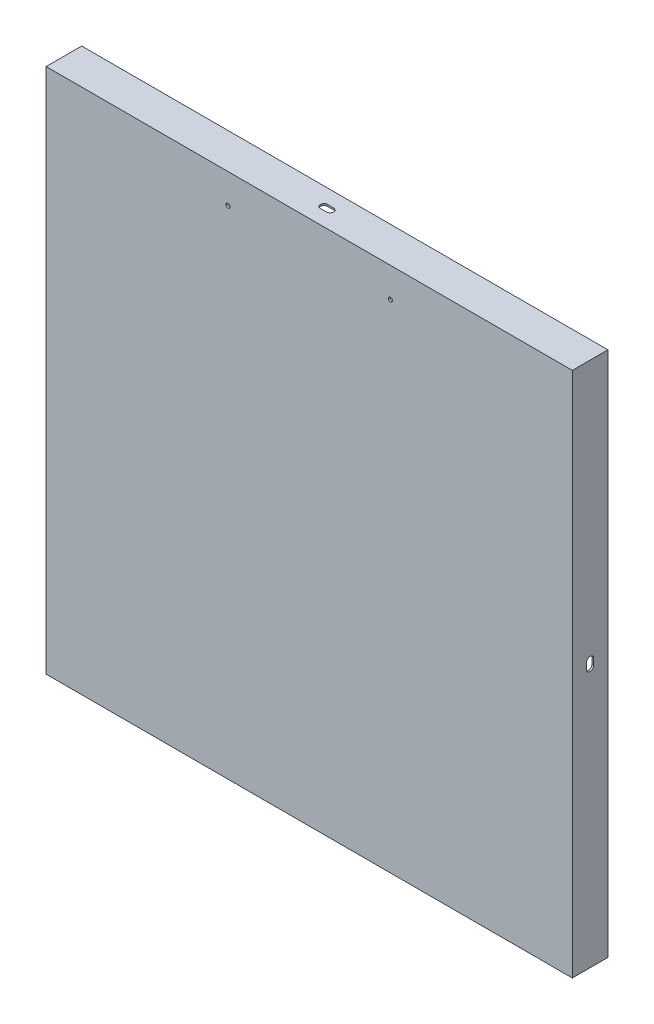
ISO-10303-21;
HEADER;
FILE_DESCRIPTION(('STEP AP214'),'2;1');
FILE_NAME('part.step','',(''),(''),'','','');
FILE_SCHEMA(('AUTOMOTIVE_DESIGN { 1 0 10303 214 1 1 1 1 }'));
ENDSEC;
DATA;
#1=APPLICATION_CONTEXT('core data for automotive mechanical design processes');
#2=APPLICATION_PROTOCOL_DEFINITION('international standard','automotive_design',2000,#1);
#3=PRODUCT_CONTEXT('',#1,'mechanical');
#4=PRODUCT('Part','Part','',(#3));
#5=PRODUCT_RELATED_PRODUCT_CATEGORY('part','',(#4));
#6=PRODUCT_DEFINITION_FORMATION('','',#4);
#7=PRODUCT_DEFINITION_CONTEXT('part definition',#1,'design');
#8=PRODUCT_DEFINITION('design','',#6,#7);
#9=PRODUCT_DEFINITION_SHAPE('','',#8);
#10=(LENGTH_UNIT() NAMED_UNIT(*) SI_UNIT(.MILLI.,.METRE.));
#11=(NAMED_UNIT(*) PLANE_ANGLE_UNIT() SI_UNIT($,.RADIAN.));
#12=(NAMED_UNIT(*) SI_UNIT($,.STERADIAN.) SOLID_ANGLE_UNIT());
#13=UNCERTAINTY_MEASURE_WITH_UNIT(LENGTH_MEASURE(1.E-05),#10,'distance_accuracy_value','');
#14=(GEOMETRIC_REPRESENTATION_CONTEXT(3) GLOBAL_UNCERTAINTY_ASSIGNED_CONTEXT((#13)) GLOBAL_UNIT_ASSIGNED_CONTEXT((#10,
#11,#12)) REPRESENTATION_CONTEXT('',''));
#15=CARTESIAN_POINT('',(0.,0.,0.));
#16=DIRECTION('',(0.,0.,1.));
#17=DIRECTION('',(1.,0.,0.));
#18=AXIS2_PLACEMENT_3D('',#15,#16,#17);
#19=CARTESIAN_POINT('',(444.,0.,-30.));
#20=DIRECTION('',(0.,-1.,0.));
#21=DIRECTION('',(1.,0.,0.));
#22=AXIS2_PLACEMENT_3D('',#19,#20,#21);
#23=PLANE('',#22);
#24=CARTESIAN_POINT('',(224.5,0.,-15.));
#25=DIRECTION('',(0.,1.,0.));
#26=DIRECTION('',(0.,0.,1.));
#27=AXIS2_PLACEMENT_3D('',#24,#25,#26);
#28=CIRCLE('',#27,3.);
#29=CARTESIAN_POINT('',(224.5,0.,-12.));
#30=VERTEX_POINT('',#29);
#31=CARTESIAN_POINT('',(224.5,0.,-18.));
#32=VERTEX_POINT('',#31);
#33=EDGE_CURVE('E254',#30,#32,#28,.T.);
#34=ORIENTED_EDGE('',*,*,#33,.T.);
#35=DIRECTION('',(-1.,0.,0.));
#36=VECTOR('',#35,1.);
#37=CARTESIAN_POINT('',(224.5,0.,-18.));
#38=LINE('',#37,#36);
#39=CARTESIAN_POINT('',(219.5,0.,-18.));
#40=VERTEX_POINT('',#39);
#41=EDGE_CURVE('E257',#32,#40,#38,.T.);
#42=ORIENTED_EDGE('',*,*,#41,.T.);
#43=CARTESIAN_POINT('',(219.5,0.,-15.));
#44=DIRECTION('',(0.,1.,0.));
#45=DIRECTION('',(0.,0.,1.));
#46=AXIS2_PLACEMENT_3D('',#43,#44,#45);
#47=CIRCLE('',#46,3.);
#48=CARTESIAN_POINT('',(219.5,0.,-12.));
#49=VERTEX_POINT('',#48);
#50=EDGE_CURVE('E261',#40,#49,#47,.T.);
#51=ORIENTED_EDGE('',*,*,#50,.T.);
#52=DIRECTION('',(1.,0.,0.));
#53=VECTOR('',#52,1.);
#54=CARTESIAN_POINT('',(224.5,0.,-12.));
#55=LINE('',#54,#53);
#56=EDGE_CURVE('E264',#49,#30,#55,.T.);
#57=ORIENTED_EDGE('',*,*,#56,.T.);
#58=EDGE_LOOP('',(#34,#42,#51,#57));
#59=FACE_BOUND('',#58,.T.);
#60=DIRECTION('',(1.,0.,0.));
#61=VECTOR('',#60,1.);
#62=CARTESIAN_POINT('',(444.,0.,0.));
#63=LINE('',#62,#61);
#64=CARTESIAN_POINT('',(0.,0.,0.));
#65=VERTEX_POINT('',#64);
#66=CARTESIAN_POINT('',(444.,0.,0.));
#67=VERTEX_POINT('',#66);
#68=EDGE_CURVE('E345',#65,#67,#63,.T.);
#69=ORIENTED_EDGE('',*,*,#68,.F.);
#70=DIRECTION('',(0.,0.,1.));
#71=VECTOR('',#70,1.);
#72=CARTESIAN_POINT('',(0.,0.,-30.));
#73=LINE('',#72,#71);
#74=CARTESIAN_POINT('',(0.,0.,-30.));
#75=VERTEX_POINT('',#74);
#76=EDGE_CURVE('E370',#75,#65,#73,.T.);
#77=ORIENTED_EDGE('',*,*,#76,.F.);
#78=DIRECTION('',(1.,0.,0.));
#79=VECTOR('',#78,1.);
#80=CARTESIAN_POINT('',(444.,0.,-30.));
#81=LINE('',#80,#79);
#82=CARTESIAN_POINT('',(444.,0.,-30.));
#83=VERTEX_POINT('',#82);
#84=EDGE_CURVE('E346',#75,#83,#81,.T.);
#85=ORIENTED_EDGE('',*,*,#84,.T.);
#86=DIRECTION('',(0.,0.,1.));
#87=VECTOR('',#86,1.);
#88=CARTESIAN_POINT('',(444.,0.,-30.));
#89=LINE('',#88,#87);
#90=EDGE_CURVE('E359',#83,#67,#89,.T.);
#91=ORIENTED_EDGE('',*,*,#90,.T.);
#92=EDGE_LOOP('',(#69,#77,#85,#91));
#93=FACE_BOUND('',#92,.T.);
#94=ADVANCED_FACE('F35',(#59,#93),#23,.T.);
#95=CARTESIAN_POINT('',(0.,0.,-30.));
#96=DIRECTION('',(-1.,0.,0.));
#97=DIRECTION('',(0.,0.,1.));
#98=AXIS2_PLACEMENT_3D('',#95,#96,#97);
#99=PLANE('',#98);
#100=CARTESIAN_POINT('',(0.,224.5,-15.));
#101=DIRECTION('',(-1.,0.,0.));
#102=DIRECTION('',(0.,0.,1.));
#103=AXIS2_PLACEMENT_3D('',#100,#101,#102);
#104=CIRCLE('',#103,3.);
#105=CARTESIAN_POINT('',(0.,224.5,-12.));
#106=VERTEX_POINT('',#105);
#107=CARTESIAN_POINT('',(0.,224.5,-18.));
#108=VERTEX_POINT('',#107);
#109=EDGE_CURVE('E49',#106,#108,#104,.T.);
#110=ORIENTED_EDGE('',*,*,#109,.F.);
#111=DIRECTION('',(0.,1.,0.));
#112=VECTOR('',#111,1.);
#113=CARTESIAN_POINT('',(0.,224.5,-12.));
#114=LINE('',#113,#112);
#115=CARTESIAN_POINT('',(0.,219.5,-12.));
#116=VERTEX_POINT('',#115);
#117=EDGE_CURVE('E219',#116,#106,#114,.T.);
#118=ORIENTED_EDGE('',*,*,#117,.F.);
#119=CARTESIAN_POINT('',(0.,219.5,-15.));
#120=DIRECTION('',(-1.,0.,0.));
#121=DIRECTION('',(0.,0.,1.));
#122=AXIS2_PLACEMENT_3D('',#119,#120,#121);
#123=CIRCLE('',#122,3.);
#124=CARTESIAN_POINT('',(0.,219.5,-18.));
#125=VERTEX_POINT('',#124);
#126=EDGE_CURVE('E222',#125,#116,#123,.T.);
#127=ORIENTED_EDGE('',*,*,#126,.F.);
#128=DIRECTION('',(0.,-1.,0.));
#129=VECTOR('',#128,1.);
#130=CARTESIAN_POINT('',(0.,224.5,-18.));
#131=LINE('',#130,#129);
#132=EDGE_CURVE('E228',#108,#125,#131,.T.);
#133=ORIENTED_EDGE('',*,*,#132,.F.);
#134=EDGE_LOOP('',(#110,#118,#127,#133));
#135=FACE_BOUND('',#134,.T.);
#136=DIRECTION('',(0.,-1.,0.));
#137=VECTOR('',#136,1.);
#138=CARTESIAN_POINT('',(0.,0.,0.));
#139=LINE('',#138,#137);
#140=CARTESIAN_POINT('',(0.,444.,0.));
#141=VERTEX_POINT('',#140);
#142=EDGE_CURVE('E350',#141,#65,#139,.T.);
#143=ORIENTED_EDGE('',*,*,#142,.F.);
#144=DIRECTION('',(0.,0.,1.));
#145=VECTOR('',#144,1.);
#146=CARTESIAN_POINT('',(0.,444.,-30.));
#147=LINE('',#146,#145);
#148=CARTESIAN_POINT('',(0.,444.,-30.));
#149=VERTEX_POINT('',#148);
#150=EDGE_CURVE('E373',#149,#141,#147,.T.);
#151=ORIENTED_EDGE('',*,*,#150,.F.);
#152=DIRECTION('',(0.,-1.,0.));
#153=VECTOR('',#152,1.);
#154=CARTESIAN_POINT('',(0.,0.,-30.));
#155=LINE('',#154,#153);
#156=EDGE_CURVE('E356',#149,#75,#155,.T.);
#157=ORIENTED_EDGE('',*,*,#156,.T.);
#158=ORIENTED_EDGE('',*,*,#76,.T.);
#159=EDGE_LOOP('',(#143,#151,#157,#158));
#160=FACE_BOUND('',#159,.T.);
#161=ADVANCED_FACE('F417',(#135,#160),#99,.T.);
#162=CARTESIAN_POINT('',(0.,444.,-30.));
#163=DIRECTION('',(0.,1.,0.));
#164=DIRECTION('',(0.,0.,1.));
#165=AXIS2_PLACEMENT_3D('',#162,#163,#164);
#166=PLANE('',#165);
#167=CARTESIAN_POINT('',(224.5,444.,-15.));
#168=DIRECTION('',(0.,1.,0.));
#169=DIRECTION('',(0.,0.,1.));
#170=AXIS2_PLACEMENT_3D('',#167,#168,#169);
#171=CIRCLE('',#170,3.);
#172=CARTESIAN_POINT('',(224.5,444.,-12.));
#173=VERTEX_POINT('',#172);
#174=CARTESIAN_POINT('',(224.5,444.,-18.));
#175=VERTEX_POINT('',#174);
#176=EDGE_CURVE('E253',#173,#175,#171,.T.);
#177=ORIENTED_EDGE('',*,*,#176,.F.);
#178=DIRECTION('',(1.,0.,0.));
#179=VECTOR('',#178,1.);
#180=CARTESIAN_POINT('',(224.5,444.,-12.));
#181=LINE('',#180,#179);
#182=CARTESIAN_POINT('',(219.5,444.,-12.));
#183=VERTEX_POINT('',#182);
#184=EDGE_CURVE('E258',#183,#173,#181,.T.);
#185=ORIENTED_EDGE('',*,*,#184,.F.);
#186=CARTESIAN_POINT('',(219.5,444.,-15.));
#187=DIRECTION('',(0.,1.,0.));
#188=DIRECTION('',(0.,0.,1.));
#189=AXIS2_PLACEMENT_3D('',#186,#187,#188);
#190=CIRCLE('',#189,3.);
#191=CARTESIAN_POINT('',(219.5,444.,-18.));
#192=VERTEX_POINT('',#191);
#193=EDGE_CURVE('E272',#192,#183,#190,.T.);
#194=ORIENTED_EDGE('',*,*,#193,.F.);
#195=DIRECTION('',(-1.,0.,0.));
#196=VECTOR('',#195,1.);
#197=CARTESIAN_POINT('',(224.5,444.,-18.));
#198=LINE('',#197,#196);
#199=EDGE_CURVE('E269',#175,#192,#198,.T.);
#200=ORIENTED_EDGE('',*,*,#199,.F.);
#201=EDGE_LOOP('',(#177,#185,#194,#200));
#202=FACE_BOUND('',#201,.T.);
#203=DIRECTION('',(-1.,0.,0.));
#204=VECTOR('',#203,1.);
#205=CARTESIAN_POINT('',(0.,444.,0.));
#206=LINE('',#205,#204);
#207=CARTESIAN_POINT('',(444.,444.,0.));
#208=VERTEX_POINT('',#207);
#209=EDGE_CURVE('E365',#208,#141,#206,.T.);
#210=ORIENTED_EDGE('',*,*,#209,.F.);
#211=DIRECTION('',(0.,0.,1.));
#212=VECTOR('',#211,1.);
#213=CARTESIAN_POINT('',(444.,444.,-30.));
#214=LINE('',#213,#212);
#215=CARTESIAN_POINT('',(444.,444.,-30.));
#216=VERTEX_POINT('',#215);
#217=EDGE_CURVE('E375',#216,#208,#214,.T.);
#218=ORIENTED_EDGE('',*,*,#217,.F.);
#219=DIRECTION('',(-1.,0.,0.));
#220=VECTOR('',#219,1.);
#221=CARTESIAN_POINT('',(0.,444.,-30.));
#222=LINE('',#221,#220);
#223=EDGE_CURVE('E353',#216,#149,#222,.T.);
#224=ORIENTED_EDGE('',*,*,#223,.T.);
#225=ORIENTED_EDGE('',*,*,#150,.T.);
#226=EDGE_LOOP('',(#210,#218,#224,#225));
#227=FACE_BOUND('',#226,.T.);
#228=ADVANCED_FACE('F422',(#202,#227),#166,.T.);
#229=CARTESIAN_POINT('',(444.,444.,-30.));
#230=DIRECTION('',(1.,0.,0.));
#231=DIRECTION('',(0.,0.,-1.));
#232=AXIS2_PLACEMENT_3D('',#229,#230,#231);
#233=PLANE('',#232);
#234=CARTESIAN_POINT('',(444.,224.5,-15.));
#235=DIRECTION('',(-1.,0.,0.));
#236=DIRECTION('',(0.,0.,1.));
#237=AXIS2_PLACEMENT_3D('',#234,#235,#236);
#238=CIRCLE('',#237,3.);
#239=CARTESIAN_POINT('',(444.,224.5,-12.));
#240=VERTEX_POINT('',#239);
#241=CARTESIAN_POINT('',(444.,224.5,-18.));
#242=VERTEX_POINT('',#241);
#243=EDGE_CURVE('E202',#240,#242,#238,.T.);
#244=ORIENTED_EDGE('',*,*,#243,.T.);
#245=DIRECTION('',(0.,-1.,0.));
#246=VECTOR('',#245,1.);
#247=CARTESIAN_POINT('',(444.,224.5,-18.));
#248=LINE('',#247,#246);
#249=CARTESIAN_POINT('',(444.,219.5,-18.));
#250=VERTEX_POINT('',#249);
#251=EDGE_CURVE('E210',#242,#250,#248,.T.);
#252=ORIENTED_EDGE('',*,*,#251,.T.);
#253=CARTESIAN_POINT('',(444.,219.5,-15.));
#254=DIRECTION('',(-1.,0.,0.));
#255=DIRECTION('',(0.,0.,1.));
#256=AXIS2_PLACEMENT_3D('',#253,#254,#255);
#257=CIRCLE('',#256,3.);
#258=CARTESIAN_POINT('',(444.,219.5,-12.));
#259=VERTEX_POINT('',#258);
#260=EDGE_CURVE('E57',#250,#259,#257,.T.);
#261=ORIENTED_EDGE('',*,*,#260,.T.);
#262=DIRECTION('',(0.,1.,0.));
#263=VECTOR('',#262,1.);
#264=CARTESIAN_POINT('',(444.,224.5,-12.));
#265=LINE('',#264,#263);
#266=EDGE_CURVE('E218',#259,#240,#265,.T.);
#267=ORIENTED_EDGE('',*,*,#266,.T.);
#268=EDGE_LOOP('',(#244,#252,#261,#267));
#269=FACE_BOUND('',#268,.T.);
#270=DIRECTION('',(0.,1.,0.));
#271=VECTOR('',#270,1.);
#272=CARTESIAN_POINT('',(444.,444.,0.));
#273=LINE('',#272,#271);
#274=EDGE_CURVE('E362',#67,#208,#273,.T.);
#275=ORIENTED_EDGE('',*,*,#274,.F.);
#276=ORIENTED_EDGE('',*,*,#90,.F.);
#277=DIRECTION('',(0.,1.,0.));
#278=VECTOR('',#277,1.);
#279=CARTESIAN_POINT('',(444.,444.,-30.));
#280=LINE('',#279,#278);
#281=EDGE_CURVE('E349',#83,#216,#280,.T.);
#282=ORIENTED_EDGE('',*,*,#281,.T.);
#283=ORIENTED_EDGE('',*,*,#217,.T.);
#284=EDGE_LOOP('',(#275,#276,#282,#283));
#285=FACE_BOUND('',#284,.T.);
#286=ADVANCED_FACE('F215',(#269,#285),#233,.T.);
#287=CARTESIAN_POINT('',(0.,0.,-30.));
#288=DIRECTION('',(0.,0.,-1.));
#289=DIRECTION('',(-1.,0.,0.));
#290=AXIS2_PLACEMENT_3D('',#287,#288,#289);
#291=PLANE('',#290);
#292=DIRECTION('',(0.,1.,0.));
#293=VECTOR('',#292,1.);
#294=CARTESIAN_POINT('',(1.5,442.5,-30.));
#295=LINE('',#294,#293);
#296=CARTESIAN_POINT('',(1.5,1.5,-30.));
#297=VERTEX_POINT('',#296);
#298=CARTESIAN_POINT('',(1.5,442.5,-30.));
#299=VERTEX_POINT('',#298);
#300=EDGE_CURVE('E303',#297,#299,#295,.T.);
#301=ORIENTED_EDGE('',*,*,#300,.F.);
#302=DIRECTION('',(-1.,0.,0.));
#303=VECTOR('',#302,1.);
#304=CARTESIAN_POINT('',(1.5,1.5,-30.));
#305=LINE('',#304,#303);
#306=CARTESIAN_POINT('',(442.5,1.5,-30.));
#307=VERTEX_POINT('',#306);
#308=EDGE_CURVE('E308',#307,#297,#305,.T.);
#309=ORIENTED_EDGE('',*,*,#308,.F.);
#310=DIRECTION('',(0.,-1.,0.));
#311=VECTOR('',#310,1.);
#312=CARTESIAN_POINT('',(442.5,1.5,-30.));
#313=LINE('',#312,#311);
#314=CARTESIAN_POINT('',(442.5,442.5,-30.));
#315=VERTEX_POINT('',#314);
#316=EDGE_CURVE('E322',#315,#307,#313,.T.);
#317=ORIENTED_EDGE('',*,*,#316,.F.);
#318=DIRECTION('',(1.,0.,0.));
#319=VECTOR('',#318,1.);
#320=CARTESIAN_POINT('',(442.5,442.5,-30.));
#321=LINE('',#320,#319);
#322=EDGE_CURVE('E319',#299,#315,#321,.T.);
#323=ORIENTED_EDGE('',*,*,#322,.F.);
#324=EDGE_LOOP('',(#301,#309,#317,#323));
#325=FACE_BOUND('',#324,.T.);
#326=ORIENTED_EDGE('',*,*,#84,.F.);
#327=ORIENTED_EDGE('',*,*,#156,.F.);
#328=ORIENTED_EDGE('',*,*,#223,.F.);
#329=ORIENTED_EDGE('',*,*,#281,.F.);
#330=EDGE_LOOP('',(#326,#327,#328,#329));
#331=FACE_BOUND('',#330,.T.);
#332=ADVANCED_FACE('F438',(#325,#331),#291,.T.);
#333=CARTESIAN_POINT('',(0.,0.,0.));
#334=DIRECTION('',(0.,0.,-1.));
#335=DIRECTION('',(-1.,0.,0.));
#336=AXIS2_PLACEMENT_3D('',#333,#334,#335);
#337=PLANE('',#336);
#338=CARTESIAN_POINT('',(153.5,419.,0.));
#339=DIRECTION('',(0.,0.,-1.));
#340=DIRECTION('',(-1.,0.,0.));
#341=AXIS2_PLACEMENT_3D('',#338,#339,#340);
#342=CIRCLE('',#341,1.70000000000001);
#343=CARTESIAN_POINT('',(151.8,419.,0.));
#344=VERTEX_POINT('',#343);
#345=EDGE_CURVE('E339',#344,#344,#342,.T.);
#346=ORIENTED_EDGE('',*,*,#345,.T.);
#347=EDGE_LOOP('',(#346));
#348=FACE_BOUND('',#347,.T.);
#349=CARTESIAN_POINT('',(290.5,419.,0.));
#350=DIRECTION('',(0.,0.,-1.));
#351=DIRECTION('',(-1.,0.,0.));
#352=AXIS2_PLACEMENT_3D('',#349,#350,#351);
#353=CIRCLE('',#352,1.69999999999995);
#354=CARTESIAN_POINT('',(288.8,419.,0.));
#355=VERTEX_POINT('',#354);
#356=EDGE_CURVE('E342',#355,#355,#353,.T.);
#357=ORIENTED_EDGE('',*,*,#356,.T.);
#358=EDGE_LOOP('',(#357));
#359=FACE_BOUND('',#358,.T.);
#360=ORIENTED_EDGE('',*,*,#68,.T.);
#361=ORIENTED_EDGE('',*,*,#274,.T.);
#362=ORIENTED_EDGE('',*,*,#209,.T.);
#363=ORIENTED_EDGE('',*,*,#142,.T.);
#364=EDGE_LOOP('',(#360,#361,#362,#363));
#365=FACE_BOUND('',#364,.T.);
#366=ADVANCED_FACE('F432',(#348,#359,#365),#337,.F.);
#367=CARTESIAN_POINT('',(290.5,419.,0.));
#368=DIRECTION('',(0.,0.,-1.));
#369=DIRECTION('',(-1.,0.,0.));
#370=AXIS2_PLACEMENT_3D('',#367,#368,#369);
#371=CYLINDRICAL_SURFACE('',#370,1.69999999999995);
#372=CARTESIAN_POINT('',(290.5,419.,-1.5));
#373=DIRECTION('',(0.,0.,1.));
#374=DIRECTION('',(1.,0.,0.));
#375=AXIS2_PLACEMENT_3D('',#372,#373,#374);
#376=CIRCLE('',#375,1.69999999999995);
#377=CARTESIAN_POINT('',(292.2,419.,-1.5));
#378=VERTEX_POINT('',#377);
#379=EDGE_CURVE('E336',#378,#378,#376,.F.);
#380=ORIENTED_EDGE('',*,*,#379,.T.);
#381=EDGE_LOOP('',(#380));
#382=FACE_BOUND('',#381,.T.);
#383=ORIENTED_EDGE('',*,*,#356,.F.);
#384=EDGE_LOOP('',(#383));
#385=FACE_BOUND('',#384,.T.);
#386=ADVANCED_FACE('F451',(#382,#385),#371,.F.);
#387=CARTESIAN_POINT('',(153.5,419.,0.));
#388=DIRECTION('',(0.,0.,-1.));
#389=DIRECTION('',(-1.,0.,0.));
#390=AXIS2_PLACEMENT_3D('',#387,#388,#389);
#391=CYLINDRICAL_SURFACE('',#390,1.70000000000001);
#392=CARTESIAN_POINT('',(153.5,419.,-1.5));
#393=DIRECTION('',(0.,0.,1.));
#394=DIRECTION('',(1.,0.,0.));
#395=AXIS2_PLACEMENT_3D('',#392,#393,#394);
#396=CIRCLE('',#395,1.70000000000001);
#397=CARTESIAN_POINT('',(155.2,419.,-1.5));
#398=VERTEX_POINT('',#397);
#399=EDGE_CURVE('E329',#398,#398,#396,.F.);
#400=ORIENTED_EDGE('',*,*,#399,.T.);
#401=EDGE_LOOP('',(#400));
#402=FACE_BOUND('',#401,.T.);
#403=ORIENTED_EDGE('',*,*,#345,.F.);
#404=EDGE_LOOP('',(#403));
#405=FACE_BOUND('',#404,.T.);
#406=ADVANCED_FACE('F458',(#402,#405),#391,.F.);
#407=CARTESIAN_POINT('',(0.,0.,-1.5));
#408=DIRECTION('',(0.,0.,1.));
#409=DIRECTION('',(1.,0.,0.));
#410=AXIS2_PLACEMENT_3D('',#407,#408,#409);
#411=PLANE('',#410);
#412=ORIENTED_EDGE('',*,*,#399,.F.);
#413=EDGE_LOOP('',(#412));
#414=FACE_BOUND('',#413,.T.);
#415=DIRECTION('',(0.,1.,0.));
#416=VECTOR('',#415,1.);
#417=CARTESIAN_POINT('',(1.5,442.5,-1.5));
#418=LINE('',#417,#416);
#419=CARTESIAN_POINT('',(1.5,1.5,-1.5));
#420=VERTEX_POINT('',#419);
#421=CARTESIAN_POINT('',(1.5,442.5,-1.5));
#422=VERTEX_POINT('',#421);
#423=EDGE_CURVE('E304',#420,#422,#418,.T.);
#424=ORIENTED_EDGE('',*,*,#423,.T.);
#425=DIRECTION('',(1.,0.,0.));
#426=VECTOR('',#425,1.);
#427=CARTESIAN_POINT('',(442.5,442.5,-1.5));
#428=LINE('',#427,#426);
#429=CARTESIAN_POINT('',(442.5,442.5,-1.5));
#430=VERTEX_POINT('',#429);
#431=EDGE_CURVE('E307',#422,#430,#428,.T.);
#432=ORIENTED_EDGE('',*,*,#431,.T.);
#433=DIRECTION('',(0.,-1.,0.));
#434=VECTOR('',#433,1.);
#435=CARTESIAN_POINT('',(442.5,1.5,-1.5));
#436=LINE('',#435,#434);
#437=CARTESIAN_POINT('',(442.5,1.5,-1.5));
#438=VERTEX_POINT('',#437);
#439=EDGE_CURVE('E311',#430,#438,#436,.T.);
#440=ORIENTED_EDGE('',*,*,#439,.T.);
#441=DIRECTION('',(-1.,0.,0.));
#442=VECTOR('',#441,1.);
#443=CARTESIAN_POINT('',(1.5,1.5,-1.5));
#444=LINE('',#443,#442);
#445=EDGE_CURVE('E314',#438,#420,#444,.T.);
#446=ORIENTED_EDGE('',*,*,#445,.T.);
#447=EDGE_LOOP('',(#424,#432,#440,#446));
#448=FACE_BOUND('',#447,.T.);
#449=ORIENTED_EDGE('',*,*,#379,.F.);
#450=EDGE_LOOP('',(#449));
#451=FACE_BOUND('',#450,.T.);
#452=ADVANCED_FACE('F462',(#414,#448,#451),#411,.F.);
#453=CARTESIAN_POINT('',(1.5,442.5,-1.5));
#454=DIRECTION('',(-1.,0.,0.));
#455=DIRECTION('',(0.,0.,1.));
#456=AXIS2_PLACEMENT_3D('',#453,#454,#455);
#457=PLANE('',#456);
#458=DIRECTION('',(0.,1.,0.));
#459=VECTOR('',#458,1.);
#460=CARTESIAN_POINT('',(1.5,442.5,-12.0000000000001));
#461=LINE('',#460,#459);
#462=CARTESIAN_POINT('',(1.5,219.5,-12.));
#463=VERTEX_POINT('',#462);
#464=CARTESIAN_POINT('',(1.5,224.5,-12.));
#465=VERTEX_POINT('',#464);
#466=EDGE_CURVE('E247',#463,#465,#461,.T.);
#467=ORIENTED_EDGE('',*,*,#466,.T.);
#468=CARTESIAN_POINT('',(1.5,224.5,-15.));
#469=DIRECTION('',(-1.,0.,0.));
#470=DIRECTION('',(0.,0.,1.));
#471=AXIS2_PLACEMENT_3D('',#468,#469,#470);
#472=CIRCLE('',#471,3.);
#473=CARTESIAN_POINT('',(1.5,224.5,-18.));
#474=VERTEX_POINT('',#473);
#475=EDGE_CURVE('E250',#465,#474,#472,.T.);
#476=ORIENTED_EDGE('',*,*,#475,.T.);
#477=DIRECTION('',(0.,-1.,0.));
#478=VECTOR('',#477,1.);
#479=CARTESIAN_POINT('',(1.5,442.5,-18.));
#480=LINE('',#479,#478);
#481=CARTESIAN_POINT('',(1.5,219.5,-18.));
#482=VERTEX_POINT('',#481);
#483=EDGE_CURVE('E235',#474,#482,#480,.T.);
#484=ORIENTED_EDGE('',*,*,#483,.T.);
#485=CARTESIAN_POINT('',(1.5,219.5,-15.));
#486=DIRECTION('',(-1.,0.,0.));
#487=DIRECTION('',(0.,0.,1.));
#488=AXIS2_PLACEMENT_3D('',#485,#486,#487);
#489=CIRCLE('',#488,3.);
#490=EDGE_CURVE('E244',#482,#463,#489,.T.);
#491=ORIENTED_EDGE('',*,*,#490,.T.);
#492=EDGE_LOOP('',(#467,#476,#484,#491));
#493=FACE_BOUND('',#492,.T.);
#494=ORIENTED_EDGE('',*,*,#300,.T.);
#495=DIRECTION('',(0.,0.,-1.));
#496=VECTOR('',#495,1.);
#497=CARTESIAN_POINT('',(1.5,442.5,-1.5));
#498=LINE('',#497,#496);
#499=EDGE_CURVE('E317',#422,#299,#498,.T.);
#500=ORIENTED_EDGE('',*,*,#499,.F.);
#501=ORIENTED_EDGE('',*,*,#423,.F.);
#502=DIRECTION('',(0.,0.,-1.));
#503=VECTOR('',#502,1.);
#504=CARTESIAN_POINT('',(1.5,1.5,-1.5));
#505=LINE('',#504,#503);
#506=EDGE_CURVE('E327',#420,#297,#505,.T.);
#507=ORIENTED_EDGE('',*,*,#506,.T.);
#508=EDGE_LOOP('',(#494,#500,#501,#507));
#509=FACE_BOUND('',#508,.T.);
#510=ADVANCED_FACE('F464',(#493,#509),#457,.F.);
#511=CARTESIAN_POINT('',(1.5,1.5,-1.5));
#512=DIRECTION('',(0.,-1.,0.));
#513=DIRECTION('',(1.,0.,0.));
#514=AXIS2_PLACEMENT_3D('',#511,#512,#513);
#515=PLANE('',#514);
#516=DIRECTION('',(1.,0.,0.));
#517=VECTOR('',#516,1.);
#518=CARTESIAN_POINT('',(1.5,1.5,-18.));
#519=LINE('',#518,#517);
#520=CARTESIAN_POINT('',(219.5,1.5,-18.));
#521=VERTEX_POINT('',#520);
#522=CARTESIAN_POINT('',(224.5,1.5,-18.));
#523=VERTEX_POINT('',#522);
#524=EDGE_CURVE('E280',#521,#523,#519,.T.);
#525=ORIENTED_EDGE('',*,*,#524,.T.);
#526=CARTESIAN_POINT('',(224.5,1.5,-15.));
#527=DIRECTION('',(0.,-1.,0.));
#528=DIRECTION('',(1.,0.,0.));
#529=AXIS2_PLACEMENT_3D('',#526,#527,#528);
#530=CIRCLE('',#529,3.);
#531=CARTESIAN_POINT('',(224.5,1.5,-12.));
#532=VERTEX_POINT('',#531);
#533=EDGE_CURVE('E300',#523,#532,#530,.T.);
#534=ORIENTED_EDGE('',*,*,#533,.T.);
#535=DIRECTION('',(-1.,0.,0.));
#536=VECTOR('',#535,1.);
#537=CARTESIAN_POINT('',(1.5,1.5,-12.));
#538=LINE('',#537,#536);
#539=CARTESIAN_POINT('',(219.5,1.5,-12.));
#540=VERTEX_POINT('',#539);
#541=EDGE_CURVE('E297',#532,#540,#538,.T.);
#542=ORIENTED_EDGE('',*,*,#541,.T.);
#543=CARTESIAN_POINT('',(219.5,1.5,-15.));
#544=DIRECTION('',(0.,-1.,0.));
#545=DIRECTION('',(1.,0.,0.));
#546=AXIS2_PLACEMENT_3D('',#543,#544,#545);
#547=CIRCLE('',#546,3.);
#548=EDGE_CURVE('E294',#540,#521,#547,.T.);
#549=ORIENTED_EDGE('',*,*,#548,.T.);
#550=EDGE_LOOP('',(#525,#534,#542,#549));
#551=FACE_BOUND('',#550,.T.);
#552=ORIENTED_EDGE('',*,*,#308,.T.);
#553=ORIENTED_EDGE('',*,*,#506,.F.);
#554=ORIENTED_EDGE('',*,*,#445,.F.);
#555=DIRECTION('',(0.,0.,-1.));
#556=VECTOR('',#555,1.);
#557=CARTESIAN_POINT('',(442.5,1.5,-1.5));
#558=LINE('',#557,#556);
#559=EDGE_CURVE('E330',#438,#307,#558,.T.);
#560=ORIENTED_EDGE('',*,*,#559,.T.);
#561=EDGE_LOOP('',(#552,#553,#554,#560));
#562=FACE_BOUND('',#561,.T.);
#563=ADVANCED_FACE('F467',(#551,#562),#515,.F.);
#564=CARTESIAN_POINT('',(442.5,1.5,-1.5));
#565=DIRECTION('',(1.,0.,0.));
#566=DIRECTION('',(0.,0.,-1.));
#567=AXIS2_PLACEMENT_3D('',#564,#565,#566);
#568=PLANE('',#567);
#569=DIRECTION('',(0.,1.,0.));
#570=VECTOR('',#569,1.);
#571=CARTESIAN_POINT('',(442.5,1.5,-18.));
#572=LINE('',#571,#570);
#573=CARTESIAN_POINT('',(442.5,219.5,-18.));
#574=VERTEX_POINT('',#573);
#575=CARTESIAN_POINT('',(442.5,224.5,-18.));
#576=VERTEX_POINT('',#575);
#577=EDGE_CURVE('E391',#574,#576,#572,.T.);
#578=ORIENTED_EDGE('',*,*,#577,.T.);
#579=CARTESIAN_POINT('',(442.5,224.5,-15.));
#580=DIRECTION('',(1.,0.,0.));
#581=DIRECTION('',(0.,0.,-1.));
#582=AXIS2_PLACEMENT_3D('',#579,#580,#581);
#583=CIRCLE('',#582,3.);
#584=CARTESIAN_POINT('',(442.5,224.5,-12.));
#585=VERTEX_POINT('',#584);
#586=EDGE_CURVE('E11',#576,#585,#583,.T.);
#587=ORIENTED_EDGE('',*,*,#586,.T.);
#588=DIRECTION('',(0.,-1.,0.));
#589=VECTOR('',#588,1.);
#590=CARTESIAN_POINT('',(442.5,1.5,-11.9999999999999));
#591=LINE('',#590,#589);
#592=CARTESIAN_POINT('',(442.5,219.5,-12.));
#593=VERTEX_POINT('',#592);
#594=EDGE_CURVE('E42',#585,#593,#591,.T.);
#595=ORIENTED_EDGE('',*,*,#594,.T.);
#596=CARTESIAN_POINT('',(442.5,219.5,-15.));
#597=DIRECTION('',(1.,0.,0.));
#598=DIRECTION('',(0.,0.,-1.));
#599=AXIS2_PLACEMENT_3D('',#596,#597,#598);
#600=CIRCLE('',#599,3.);
#601=EDGE_CURVE('E393',#593,#574,#600,.T.);
#602=ORIENTED_EDGE('',*,*,#601,.T.);
#603=EDGE_LOOP('',(#578,#587,#595,#602));
#604=FACE_BOUND('',#603,.T.);
#605=ORIENTED_EDGE('',*,*,#316,.T.);
#606=ORIENTED_EDGE('',*,*,#559,.F.);
#607=ORIENTED_EDGE('',*,*,#439,.F.);
#608=DIRECTION('',(0.,0.,-1.));
#609=VECTOR('',#608,1.);
#610=CARTESIAN_POINT('',(442.5,442.5,-1.5));
#611=LINE('',#610,#609);
#612=EDGE_CURVE('E332',#430,#315,#611,.T.);
#613=ORIENTED_EDGE('',*,*,#612,.T.);
#614=EDGE_LOOP('',(#605,#606,#607,#613));
#615=FACE_BOUND('',#614,.T.);
#616=ADVANCED_FACE('F397',(#604,#615),#568,.F.);
#617=CARTESIAN_POINT('',(442.5,442.5,-1.5));
#618=DIRECTION('',(0.,1.,0.));
#619=DIRECTION('',(0.,0.,1.));
#620=AXIS2_PLACEMENT_3D('',#617,#618,#619);
#621=PLANE('',#620);
#622=DIRECTION('',(1.,0.,0.));
#623=VECTOR('',#622,1.);
#624=CARTESIAN_POINT('',(442.5,442.5,-12.));
#625=LINE('',#624,#623);
#626=CARTESIAN_POINT('',(219.5,442.5,-12.));
#627=VERTEX_POINT('',#626);
#628=CARTESIAN_POINT('',(224.5,442.5,-12.));
#629=VERTEX_POINT('',#628);
#630=EDGE_CURVE('E385',#627,#629,#625,.T.);
#631=ORIENTED_EDGE('',*,*,#630,.T.);
#632=CARTESIAN_POINT('',(224.5,442.5,-15.));
#633=DIRECTION('',(0.,1.,0.));
#634=DIRECTION('',(0.,0.,1.));
#635=AXIS2_PLACEMENT_3D('',#632,#633,#634);
#636=CIRCLE('',#635,3.);
#637=CARTESIAN_POINT('',(224.5,442.5,-18.));
#638=VERTEX_POINT('',#637);
#639=EDGE_CURVE('E388',#629,#638,#636,.T.);
#640=ORIENTED_EDGE('',*,*,#639,.T.);
#641=DIRECTION('',(-1.,0.,0.));
#642=VECTOR('',#641,1.);
#643=CARTESIAN_POINT('',(442.5,442.5,-18.));
#644=LINE('',#643,#642);
#645=CARTESIAN_POINT('',(219.5,442.5,-18.));
#646=VERTEX_POINT('',#645);
#647=EDGE_CURVE('E372',#638,#646,#644,.T.);
#648=ORIENTED_EDGE('',*,*,#647,.T.);
#649=CARTESIAN_POINT('',(219.5,442.5,-15.));
#650=DIRECTION('',(0.,1.,0.));
#651=DIRECTION('',(0.,0.,1.));
#652=AXIS2_PLACEMENT_3D('',#649,#650,#651);
#653=CIRCLE('',#652,3.);
#654=EDGE_CURVE('E382',#646,#627,#653,.T.);
#655=ORIENTED_EDGE('',*,*,#654,.T.);
#656=EDGE_LOOP('',(#631,#640,#648,#655));
#657=FACE_BOUND('',#656,.T.);
#658=ORIENTED_EDGE('',*,*,#322,.T.);
#659=ORIENTED_EDGE('',*,*,#612,.F.);
#660=ORIENTED_EDGE('',*,*,#431,.F.);
#661=ORIENTED_EDGE('',*,*,#499,.T.);
#662=EDGE_LOOP('',(#658,#659,#660,#661));
#663=FACE_BOUND('',#662,.T.);
#664=ADVANCED_FACE('F469',(#657,#663),#621,.F.);
#665=CARTESIAN_POINT('',(224.5,0.,-18.));
#666=DIRECTION('',(0.,0.,-1.));
#667=DIRECTION('',(-1.,0.,0.));
#668=AXIS2_PLACEMENT_3D('',#665,#666,#667);
#669=PLANE('',#668);
#670=DIRECTION('',(0.,1.,0.));
#671=VECTOR('',#670,1.);
#672=CARTESIAN_POINT('',(224.5,0.,-18.));
#673=LINE('',#672,#671);
#674=EDGE_CURVE('E267',#638,#175,#673,.T.);
#675=ORIENTED_EDGE('',*,*,#674,.T.);
#676=ORIENTED_EDGE('',*,*,#199,.T.);
#677=DIRECTION('',(0.,1.,0.));
#678=VECTOR('',#677,1.);
#679=CARTESIAN_POINT('',(219.5,0.,-18.));
#680=LINE('',#679,#678);
#681=EDGE_CURVE('E289',#646,#192,#680,.T.);
#682=ORIENTED_EDGE('',*,*,#681,.F.);
#683=ORIENTED_EDGE('',*,*,#647,.F.);
#684=EDGE_LOOP('',(#675,#676,#682,#683));
#685=FACE_BOUND('',#684,.T.);
#686=ADVANCED_FACE('F472',(#685),#669,.F.);
#687=CARTESIAN_POINT('',(219.5,0.,-15.));
#688=DIRECTION('',(0.,1.,0.));
#689=DIRECTION('',(0.,0.,1.));
#690=AXIS2_PLACEMENT_3D('',#687,#688,#689);
#691=CYLINDRICAL_SURFACE('',#690,3.);
#692=ORIENTED_EDGE('',*,*,#681,.T.);
#693=ORIENTED_EDGE('',*,*,#193,.T.);
#694=DIRECTION('',(0.,1.,0.));
#695=VECTOR('',#694,1.);
#696=CARTESIAN_POINT('',(219.5,0.,-12.));
#697=LINE('',#696,#695);
#698=EDGE_CURVE('E285',#627,#183,#697,.T.);
#699=ORIENTED_EDGE('',*,*,#698,.F.);
#700=ORIENTED_EDGE('',*,*,#654,.F.);
#701=EDGE_LOOP('',(#692,#693,#699,#700));
#702=FACE_BOUND('',#701,.T.);
#703=ADVANCED_FACE('F495',(#702),#691,.F.);
#704=CARTESIAN_POINT('',(224.5,0.,-12.));
#705=DIRECTION('',(0.,0.,1.));
#706=DIRECTION('',(1.,0.,0.));
#707=AXIS2_PLACEMENT_3D('',#704,#705,#706);
#708=PLANE('',#707);
#709=ORIENTED_EDGE('',*,*,#698,.T.);
#710=ORIENTED_EDGE('',*,*,#184,.T.);
#711=DIRECTION('',(0.,1.,0.));
#712=VECTOR('',#711,1.);
#713=CARTESIAN_POINT('',(224.5,0.,-12.));
#714=LINE('',#713,#712);
#715=EDGE_CURVE('E281',#629,#173,#714,.T.);
#716=ORIENTED_EDGE('',*,*,#715,.F.);
#717=ORIENTED_EDGE('',*,*,#630,.F.);
#718=EDGE_LOOP('',(#709,#710,#716,#717));
#719=FACE_BOUND('',#718,.T.);
#720=ADVANCED_FACE('F499',(#719),#708,.F.);
#721=CARTESIAN_POINT('',(224.5,0.,-15.));
#722=DIRECTION('',(0.,1.,0.));
#723=DIRECTION('',(0.,0.,1.));
#724=AXIS2_PLACEMENT_3D('',#721,#722,#723);
#725=CYLINDRICAL_SURFACE('',#724,3.);
#726=ORIENTED_EDGE('',*,*,#715,.T.);
#727=ORIENTED_EDGE('',*,*,#176,.T.);
#728=ORIENTED_EDGE('',*,*,#674,.F.);
#729=ORIENTED_EDGE('',*,*,#639,.F.);
#730=EDGE_LOOP('',(#726,#727,#728,#729));
#731=FACE_BOUND('',#730,.T.);
#732=ADVANCED_FACE('F486',(#731),#725,.F.);
#733=EDGE_CURVE('E290',#32,#523,#673,.T.);
#734=ORIENTED_EDGE('',*,*,#733,.F.);
#735=ORIENTED_EDGE('',*,*,#33,.F.);
#736=EDGE_CURVE('E277',#30,#532,#714,.T.);
#737=ORIENTED_EDGE('',*,*,#736,.T.);
#738=ORIENTED_EDGE('',*,*,#533,.F.);
#739=EDGE_LOOP('',(#734,#735,#737,#738));
#740=FACE_BOUND('',#739,.T.);
#741=ADVANCED_FACE('F482',(#740),#725,.F.);
#742=ORIENTED_EDGE('',*,*,#736,.F.);
#743=ORIENTED_EDGE('',*,*,#56,.F.);
#744=EDGE_CURVE('E282',#49,#540,#697,.T.);
#745=ORIENTED_EDGE('',*,*,#744,.T.);
#746=ORIENTED_EDGE('',*,*,#541,.F.);
#747=EDGE_LOOP('',(#742,#743,#745,#746));
#748=FACE_BOUND('',#747,.T.);
#749=ADVANCED_FACE('F485',(#748),#708,.F.);
#750=ORIENTED_EDGE('',*,*,#744,.F.);
#751=ORIENTED_EDGE('',*,*,#50,.F.);
#752=EDGE_CURVE('E286',#40,#521,#680,.T.);
#753=ORIENTED_EDGE('',*,*,#752,.T.);
#754=ORIENTED_EDGE('',*,*,#548,.F.);
#755=EDGE_LOOP('',(#750,#751,#753,#754));
#756=FACE_BOUND('',#755,.T.);
#757=ADVANCED_FACE('F490',(#756),#691,.F.);
#758=ORIENTED_EDGE('',*,*,#752,.F.);
#759=ORIENTED_EDGE('',*,*,#41,.F.);
#760=ORIENTED_EDGE('',*,*,#733,.T.);
#761=ORIENTED_EDGE('',*,*,#524,.F.);
#762=EDGE_LOOP('',(#758,#759,#760,#761));
#763=FACE_BOUND('',#762,.T.);
#764=ADVANCED_FACE('F411',(#763),#669,.F.);
#765=CARTESIAN_POINT('',(444.,224.5,-18.));
#766=DIRECTION('',(0.,0.,-1.));
#767=DIRECTION('',(-1.,0.,0.));
#768=AXIS2_PLACEMENT_3D('',#765,#766,#767);
#769=PLANE('',#768);
#770=DIRECTION('',(-1.,0.,0.));
#771=VECTOR('',#770,1.);
#772=CARTESIAN_POINT('',(444.,219.5,-18.));
#773=LINE('',#772,#771);
#774=EDGE_CURVE('E212',#250,#574,#773,.T.);
#775=ORIENTED_EDGE('',*,*,#774,.F.);
#776=ORIENTED_EDGE('',*,*,#251,.F.);
#777=DIRECTION('',(-1.,0.,0.));
#778=VECTOR('',#777,1.);
#779=CARTESIAN_POINT('',(444.,224.5,-18.));
#780=LINE('',#779,#778);
#781=EDGE_CURVE('E197',#242,#576,#780,.T.);
#782=ORIENTED_EDGE('',*,*,#781,.T.);
#783=ORIENTED_EDGE('',*,*,#577,.F.);
#784=EDGE_LOOP('',(#775,#776,#782,#783));
#785=FACE_BOUND('',#784,.T.);
#786=ADVANCED_FACE('F211',(#785),#769,.F.);
#787=CARTESIAN_POINT('',(444.,219.5,-15.));
#788=DIRECTION('',(-1.,0.,0.));
#789=DIRECTION('',(0.,0.,1.));
#790=AXIS2_PLACEMENT_3D('',#787,#788,#789);
#791=CYLINDRICAL_SURFACE('',#790,3.);
#792=DIRECTION('',(-1.,0.,0.));
#793=VECTOR('',#792,1.);
#794=CARTESIAN_POINT('',(444.,219.5,-12.));
#795=LINE('',#794,#793);
#796=EDGE_CURVE('E237',#259,#593,#795,.T.);
#797=ORIENTED_EDGE('',*,*,#796,.F.);
#798=ORIENTED_EDGE('',*,*,#260,.F.);
#799=ORIENTED_EDGE('',*,*,#774,.T.);
#800=ORIENTED_EDGE('',*,*,#601,.F.);
#801=EDGE_LOOP('',(#797,#798,#799,#800));
#802=FACE_BOUND('',#801,.T.);
#803=ADVANCED_FACE('F401',(#802),#791,.F.);
#804=CARTESIAN_POINT('',(444.,224.5,-12.));
#805=DIRECTION('',(0.,0.,1.));
#806=DIRECTION('',(0.,-1.,0.));
#807=AXIS2_PLACEMENT_3D('',#804,#805,#806);
#808=PLANE('',#807);
#809=DIRECTION('',(-1.,0.,0.));
#810=VECTOR('',#809,1.);
#811=CARTESIAN_POINT('',(444.,224.5,-12.));
#812=LINE('',#811,#810);
#813=EDGE_CURVE('E233',#240,#585,#812,.T.);
#814=ORIENTED_EDGE('',*,*,#813,.F.);
#815=ORIENTED_EDGE('',*,*,#266,.F.);
#816=ORIENTED_EDGE('',*,*,#796,.T.);
#817=ORIENTED_EDGE('',*,*,#594,.F.);
#818=EDGE_LOOP('',(#814,#815,#816,#817));
#819=FACE_BOUND('',#818,.T.);
#820=ADVANCED_FACE('F400',(#819),#808,.F.);
#821=CARTESIAN_POINT('',(444.,224.5,-15.));
#822=DIRECTION('',(-1.,0.,0.));
#823=DIRECTION('',(0.,0.,1.));
#824=AXIS2_PLACEMENT_3D('',#821,#822,#823);
#825=CYLINDRICAL_SURFACE('',#824,3.);
#826=ORIENTED_EDGE('',*,*,#781,.F.);
#827=ORIENTED_EDGE('',*,*,#243,.F.);
#828=ORIENTED_EDGE('',*,*,#813,.T.);
#829=ORIENTED_EDGE('',*,*,#586,.F.);
#830=EDGE_LOOP('',(#826,#827,#828,#829));
#831=FACE_BOUND('',#830,.T.);
#832=ADVANCED_FACE('F199',(#831),#825,.F.);
#833=EDGE_CURVE('E236',#465,#106,#812,.T.);
#834=ORIENTED_EDGE('',*,*,#833,.T.);
#835=ORIENTED_EDGE('',*,*,#109,.T.);
#836=EDGE_CURVE('E207',#474,#108,#780,.T.);
#837=ORIENTED_EDGE('',*,*,#836,.F.);
#838=ORIENTED_EDGE('',*,*,#475,.F.);
#839=EDGE_LOOP('',(#834,#835,#837,#838));
#840=FACE_BOUND('',#839,.T.);
#841=ADVANCED_FACE('F500',(#840),#825,.F.);
#842=EDGE_CURVE('E240',#463,#116,#795,.T.);
#843=ORIENTED_EDGE('',*,*,#842,.T.);
#844=ORIENTED_EDGE('',*,*,#117,.T.);
#845=ORIENTED_EDGE('',*,*,#833,.F.);
#846=ORIENTED_EDGE('',*,*,#466,.F.);
#847=EDGE_LOOP('',(#843,#844,#845,#846));
#848=FACE_BOUND('',#847,.T.);
#849=ADVANCED_FACE('F410',(#848),#808,.F.);
#850=EDGE_CURVE('E206',#482,#125,#773,.T.);
#851=ORIENTED_EDGE('',*,*,#850,.T.);
#852=ORIENTED_EDGE('',*,*,#126,.T.);
#853=ORIENTED_EDGE('',*,*,#842,.F.);
#854=ORIENTED_EDGE('',*,*,#490,.F.);
#855=EDGE_LOOP('',(#851,#852,#853,#854));
#856=FACE_BOUND('',#855,.T.);
#857=ADVANCED_FACE('F404',(#856),#791,.F.);
#858=ORIENTED_EDGE('',*,*,#836,.T.);
#859=ORIENTED_EDGE('',*,*,#132,.T.);
#860=ORIENTED_EDGE('',*,*,#850,.F.);
#861=ORIENTED_EDGE('',*,*,#483,.F.);
#862=EDGE_LOOP('',(#858,#859,#860,#861));
#863=FACE_BOUND('',#862,.T.);
#864=ADVANCED_FACE('F413',(#863),#769,.F.);
#865=CLOSED_SHELL('',(#94,#161,#228,#286,#332,#366,#386,#406,#452,#510,#563,#616,#664,#686,#703,
#720,#732,#741,#749,#757,#764,#786,#803,#820,#832,#841,#849,#857,#864));
#866=MANIFOLD_SOLID_BREP('B2',#865);
#867=ADVANCED_BREP_SHAPE_REPRESENTATION('',(#18,#866),#14);
#868=SHAPE_DEFINITION_REPRESENTATION(#9,#867);
ENDSEC;
END-ISO-10303-21;
